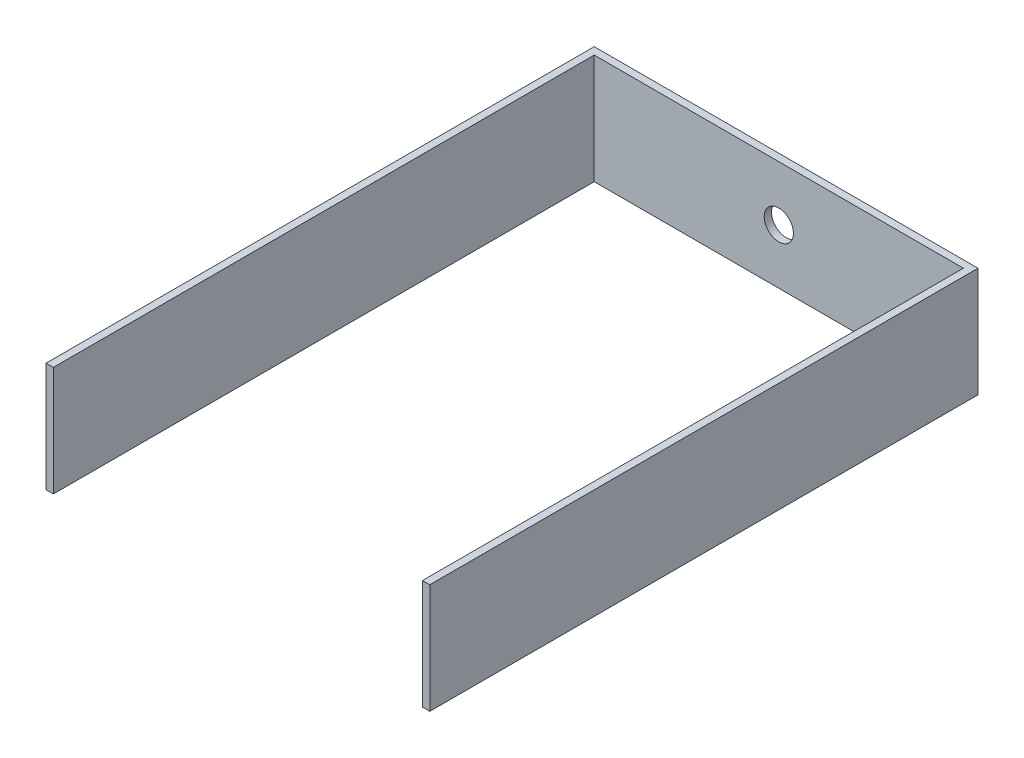
ISO-10303-21;
HEADER;
FILE_DESCRIPTION(('STEP AP214'),'2;1');
FILE_NAME('part.step','',(''),(''),'','','');
FILE_SCHEMA(('AUTOMOTIVE_DESIGN { 1 0 10303 214 1 1 1 1 }'));
ENDSEC;
DATA;
#1=APPLICATION_CONTEXT('core data for automotive mechanical design processes');
#2=APPLICATION_PROTOCOL_DEFINITION('international standard','automotive_design',2000,#1);
#3=PRODUCT_CONTEXT('',#1,'mechanical');
#4=PRODUCT('Part','Part','',(#3));
#5=PRODUCT_RELATED_PRODUCT_CATEGORY('part','',(#4));
#6=PRODUCT_DEFINITION_FORMATION('','',#4);
#7=PRODUCT_DEFINITION_CONTEXT('part definition',#1,'design');
#8=PRODUCT_DEFINITION('design','',#6,#7);
#9=PRODUCT_DEFINITION_SHAPE('','',#8);
#10=(LENGTH_UNIT() NAMED_UNIT(*) SI_UNIT(.MILLI.,.METRE.));
#11=(NAMED_UNIT(*) PLANE_ANGLE_UNIT() SI_UNIT($,.RADIAN.));
#12=(NAMED_UNIT(*) SI_UNIT($,.STERADIAN.) SOLID_ANGLE_UNIT());
#13=UNCERTAINTY_MEASURE_WITH_UNIT(LENGTH_MEASURE(1.E-05),#10,'distance_accuracy_value','');
#14=(GEOMETRIC_REPRESENTATION_CONTEXT(3) GLOBAL_UNCERTAINTY_ASSIGNED_CONTEXT((#13)) GLOBAL_UNIT_ASSIGNED_CONTEXT((#10,
#11,#12)) REPRESENTATION_CONTEXT('',''));
#15=CARTESIAN_POINT('',(0.,0.,0.));
#16=DIRECTION('',(0.,0.,1.));
#17=DIRECTION('',(1.,0.,0.));
#18=AXIS2_PLACEMENT_3D('',#15,#16,#17);
#19=CARTESIAN_POINT('',(-52.5,15.,0.));
#20=DIRECTION('',(0.,0.,-1.));
#21=DIRECTION('',(-1.,0.,0.));
#22=AXIS2_PLACEMENT_3D('',#19,#20,#21);
#23=PLANE('',#22);
#24=CARTESIAN_POINT('',(0.,0.,0.));
#25=DIRECTION('',(0.,0.,-1.));
#26=DIRECTION('',(-1.,0.,0.));
#27=AXIS2_PLACEMENT_3D('',#24,#25,#26);
#28=CIRCLE('',#27,4.);
#29=CARTESIAN_POINT('',(-4.,0.,0.));
#30=VERTEX_POINT('',#29);
#31=EDGE_CURVE('E182',#30,#30,#28,.T.);
#32=ORIENTED_EDGE('',*,*,#31,.F.);
#33=EDGE_LOOP('',(#32));
#34=FACE_BOUND('',#33,.T.);
#35=DIRECTION('',(1.,0.,0.));
#36=VECTOR('',#35,1.);
#37=CARTESIAN_POINT('',(-52.5,-15.,0.));
#38=LINE('',#37,#36);
#39=CARTESIAN_POINT('',(-52.5,-15.,0.));
#40=VERTEX_POINT('',#39);
#41=CARTESIAN_POINT('',(52.5,-15.,0.));
#42=VERTEX_POINT('',#41);
#43=EDGE_CURVE('E134',#40,#42,#38,.T.);
#44=ORIENTED_EDGE('',*,*,#43,.F.);
#45=DIRECTION('',(0.,-1.,0.));
#46=VECTOR('',#45,1.);
#47=CARTESIAN_POINT('',(-52.5,15.,0.));
#48=LINE('',#47,#46);
#49=CARTESIAN_POINT('',(-52.5,15.,0.));
#50=VERTEX_POINT('',#49);
#51=EDGE_CURVE('E11',#50,#40,#48,.T.);
#52=ORIENTED_EDGE('',*,*,#51,.F.);
#53=DIRECTION('',(1.,0.,0.));
#54=VECTOR('',#53,1.);
#55=CARTESIAN_POINT('',(-52.5,15.,0.));
#56=LINE('',#55,#54);
#57=CARTESIAN_POINT('',(52.5,15.,0.));
#58=VERTEX_POINT('',#57);
#59=EDGE_CURVE('E151',#50,#58,#56,.T.);
#60=ORIENTED_EDGE('',*,*,#59,.T.);
#61=DIRECTION('',(0.,-1.,0.));
#62=VECTOR('',#61,1.);
#63=CARTESIAN_POINT('',(52.5,15.,0.));
#64=LINE('',#63,#62);
#65=EDGE_CURVE('E89',#58,#42,#64,.T.);
#66=ORIENTED_EDGE('',*,*,#65,.T.);
#67=EDGE_LOOP('',(#44,#52,#60,#66));
#68=FACE_BOUND('',#67,.T.);
#69=ADVANCED_FACE('F35',(#34,#68),#23,.T.);
#70=CARTESIAN_POINT('',(-52.5,15.,0.));
#71=DIRECTION('',(1.,0.,0.));
#72=DIRECTION('',(0.,0.,-1.));
#73=AXIS2_PLACEMENT_3D('',#70,#71,#72);
#74=PLANE('',#73);
#75=DIRECTION('',(0.,0.,1.));
#76=VECTOR('',#75,1.);
#77=CARTESIAN_POINT('',(-52.5,-15.,0.));
#78=LINE('',#77,#76);
#79=CARTESIAN_POINT('',(-52.5,-15.,150.));
#80=VERTEX_POINT('',#79);
#81=EDGE_CURVE('E80',#40,#80,#78,.T.);
#82=ORIENTED_EDGE('',*,*,#81,.T.);
#83=DIRECTION('',(0.,-1.,0.));
#84=VECTOR('',#83,1.);
#85=CARTESIAN_POINT('',(-52.5,15.,150.));
#86=LINE('',#85,#84);
#87=CARTESIAN_POINT('',(-52.5,15.,150.));
#88=VERTEX_POINT('',#87);
#89=EDGE_CURVE('E44',#88,#80,#86,.T.);
#90=ORIENTED_EDGE('',*,*,#89,.F.);
#91=DIRECTION('',(0.,0.,1.));
#92=VECTOR('',#91,1.);
#93=CARTESIAN_POINT('',(-52.5,15.,0.));
#94=LINE('',#93,#92);
#95=EDGE_CURVE('E112',#50,#88,#94,.T.);
#96=ORIENTED_EDGE('',*,*,#95,.F.);
#97=ORIENTED_EDGE('',*,*,#51,.T.);
#98=EDGE_LOOP('',(#82,#90,#96,#97));
#99=FACE_BOUND('',#98,.T.);
#100=ADVANCED_FACE('F199',(#99),#74,.F.);
#101=CARTESIAN_POINT('',(-52.5,15.,150.));
#102=DIRECTION('',(0.,0.,-1.));
#103=DIRECTION('',(-1.,0.,0.));
#104=AXIS2_PLACEMENT_3D('',#101,#102,#103);
#105=PLANE('',#104);
#106=DIRECTION('',(1.,0.,0.));
#107=VECTOR('',#106,1.);
#108=CARTESIAN_POINT('',(-52.5,-15.,150.));
#109=LINE('',#108,#107);
#110=CARTESIAN_POINT('',(-50.5,-15.,150.));
#111=VERTEX_POINT('',#110);
#112=EDGE_CURVE('E119',#80,#111,#109,.T.);
#113=ORIENTED_EDGE('',*,*,#112,.T.);
#114=DIRECTION('',(0.,-1.,0.));
#115=VECTOR('',#114,1.);
#116=CARTESIAN_POINT('',(-50.5,15.,150.));
#117=LINE('',#116,#115);
#118=CARTESIAN_POINT('',(-50.5,15.,150.));
#119=VERTEX_POINT('',#118);
#120=EDGE_CURVE('E116',#119,#111,#117,.T.);
#121=ORIENTED_EDGE('',*,*,#120,.F.);
#122=DIRECTION('',(1.,0.,0.));
#123=VECTOR('',#122,1.);
#124=CARTESIAN_POINT('',(-52.5,15.,150.));
#125=LINE('',#124,#123);
#126=EDGE_CURVE('E106',#88,#119,#125,.T.);
#127=ORIENTED_EDGE('',*,*,#126,.F.);
#128=ORIENTED_EDGE('',*,*,#89,.T.);
#129=EDGE_LOOP('',(#113,#121,#127,#128));
#130=FACE_BOUND('',#129,.T.);
#131=ADVANCED_FACE('F117',(#130),#105,.F.);
#132=CARTESIAN_POINT('',(-50.5,15.,2.));
#133=DIRECTION('',(1.,0.,0.));
#134=DIRECTION('',(0.,0.,-1.));
#135=AXIS2_PLACEMENT_3D('',#132,#133,#134);
#136=PLANE('',#135);
#137=DIRECTION('',(0.,0.,1.));
#138=VECTOR('',#137,1.);
#139=CARTESIAN_POINT('',(-50.5,-15.,2.));
#140=LINE('',#139,#138);
#141=CARTESIAN_POINT('',(-50.5,-15.,2.));
#142=VERTEX_POINT('',#141);
#143=EDGE_CURVE('E148',#142,#111,#140,.T.);
#144=ORIENTED_EDGE('',*,*,#143,.F.);
#145=DIRECTION('',(0.,-1.,0.));
#146=VECTOR('',#145,1.);
#147=CARTESIAN_POINT('',(-50.5,15.,2.));
#148=LINE('',#147,#146);
#149=CARTESIAN_POINT('',(-50.5,15.,2.));
#150=VERTEX_POINT('',#149);
#151=EDGE_CURVE('E123',#150,#142,#148,.T.);
#152=ORIENTED_EDGE('',*,*,#151,.F.);
#153=DIRECTION('',(0.,0.,1.));
#154=VECTOR('',#153,1.);
#155=CARTESIAN_POINT('',(-50.5,15.,2.));
#156=LINE('',#155,#154);
#157=EDGE_CURVE('E111',#150,#119,#156,.T.);
#158=ORIENTED_EDGE('',*,*,#157,.T.);
#159=ORIENTED_EDGE('',*,*,#120,.T.);
#160=EDGE_LOOP('',(#144,#152,#158,#159));
#161=FACE_BOUND('',#160,.T.);
#162=ADVANCED_FACE('F125',(#161),#136,.T.);
#163=CARTESIAN_POINT('',(-50.5,15.,2.));
#164=DIRECTION('',(0.,0.,-1.));
#165=DIRECTION('',(-1.,0.,0.));
#166=AXIS2_PLACEMENT_3D('',#163,#164,#165);
#167=PLANE('',#166);
#168=CARTESIAN_POINT('',(0.,0.,2.));
#169=DIRECTION('',(0.,0.,-1.));
#170=DIRECTION('',(-1.,0.,0.));
#171=AXIS2_PLACEMENT_3D('',#168,#169,#170);
#172=CIRCLE('',#171,4.);
#173=CARTESIAN_POINT('',(-4.,0.,2.));
#174=VERTEX_POINT('',#173);
#175=EDGE_CURVE('E38',#174,#174,#172,.T.);
#176=ORIENTED_EDGE('',*,*,#175,.T.);
#177=EDGE_LOOP('',(#176));
#178=FACE_BOUND('',#177,.T.);
#179=DIRECTION('',(1.,0.,0.));
#180=VECTOR('',#179,1.);
#181=CARTESIAN_POINT('',(-50.5,-15.,2.));
#182=LINE('',#181,#180);
#183=CARTESIAN_POINT('',(50.5,-15.,2.));
#184=VERTEX_POINT('',#183);
#185=EDGE_CURVE('E146',#142,#184,#182,.T.);
#186=ORIENTED_EDGE('',*,*,#185,.T.);
#187=DIRECTION('',(0.,-1.,0.));
#188=VECTOR('',#187,1.);
#189=CARTESIAN_POINT('',(50.5,15.,2.));
#190=LINE('',#189,#188);
#191=CARTESIAN_POINT('',(50.5,15.,2.));
#192=VERTEX_POINT('',#191);
#193=EDGE_CURVE('E155',#192,#184,#190,.T.);
#194=ORIENTED_EDGE('',*,*,#193,.F.);
#195=DIRECTION('',(1.,0.,0.));
#196=VECTOR('',#195,1.);
#197=CARTESIAN_POINT('',(-50.5,15.,2.));
#198=LINE('',#197,#196);
#199=EDGE_CURVE('E127',#150,#192,#198,.T.);
#200=ORIENTED_EDGE('',*,*,#199,.F.);
#201=ORIENTED_EDGE('',*,*,#151,.T.);
#202=EDGE_LOOP('',(#186,#194,#200,#201));
#203=FACE_BOUND('',#202,.T.);
#204=ADVANCED_FACE('F169',(#178,#203),#167,.F.);
#205=CARTESIAN_POINT('',(50.5,15.,2.));
#206=DIRECTION('',(1.,0.,0.));
#207=DIRECTION('',(0.,0.,-1.));
#208=AXIS2_PLACEMENT_3D('',#205,#206,#207);
#209=PLANE('',#208);
#210=DIRECTION('',(0.,0.,1.));
#211=VECTOR('',#210,1.);
#212=CARTESIAN_POINT('',(50.5,-15.,2.));
#213=LINE('',#212,#211);
#214=CARTESIAN_POINT('',(50.5,-15.,150.));
#215=VERTEX_POINT('',#214);
#216=EDGE_CURVE('E143',#184,#215,#213,.T.);
#217=ORIENTED_EDGE('',*,*,#216,.T.);
#218=DIRECTION('',(0.,-1.,0.));
#219=VECTOR('',#218,1.);
#220=CARTESIAN_POINT('',(50.5,15.,150.));
#221=LINE('',#220,#219);
#222=CARTESIAN_POINT('',(50.5,15.,150.));
#223=VERTEX_POINT('',#222);
#224=EDGE_CURVE('E158',#223,#215,#221,.T.);
#225=ORIENTED_EDGE('',*,*,#224,.F.);
#226=DIRECTION('',(0.,0.,1.));
#227=VECTOR('',#226,1.);
#228=CARTESIAN_POINT('',(50.5,15.,2.));
#229=LINE('',#228,#227);
#230=EDGE_CURVE('E129',#192,#223,#229,.T.);
#231=ORIENTED_EDGE('',*,*,#230,.F.);
#232=ORIENTED_EDGE('',*,*,#193,.T.);
#233=EDGE_LOOP('',(#217,#225,#231,#232));
#234=FACE_BOUND('',#233,.T.);
#235=ADVANCED_FACE('F172',(#234),#209,.F.);
#236=CARTESIAN_POINT('',(52.5,15.,150.));
#237=DIRECTION('',(0.,0.,1.));
#238=DIRECTION('',(1.,0.,0.));
#239=AXIS2_PLACEMENT_3D('',#236,#237,#238);
#240=PLANE('',#239);
#241=DIRECTION('',(-1.,0.,0.));
#242=VECTOR('',#241,1.);
#243=CARTESIAN_POINT('',(52.5,-15.,150.));
#244=LINE('',#243,#242);
#245=CARTESIAN_POINT('',(52.5,-15.,150.));
#246=VERTEX_POINT('',#245);
#247=EDGE_CURVE('E140',#246,#215,#244,.T.);
#248=ORIENTED_EDGE('',*,*,#247,.F.);
#249=DIRECTION('',(0.,-1.,0.));
#250=VECTOR('',#249,1.);
#251=CARTESIAN_POINT('',(52.5,15.,150.));
#252=LINE('',#251,#250);
#253=CARTESIAN_POINT('',(52.5,15.,150.));
#254=VERTEX_POINT('',#253);
#255=EDGE_CURVE('E160',#254,#246,#252,.T.);
#256=ORIENTED_EDGE('',*,*,#255,.F.);
#257=DIRECTION('',(-1.,0.,0.));
#258=VECTOR('',#257,1.);
#259=CARTESIAN_POINT('',(52.5,15.,150.));
#260=LINE('',#259,#258);
#261=EDGE_CURVE('E176',#254,#223,#260,.T.);
#262=ORIENTED_EDGE('',*,*,#261,.T.);
#263=ORIENTED_EDGE('',*,*,#224,.T.);
#264=EDGE_LOOP('',(#248,#256,#262,#263));
#265=FACE_BOUND('',#264,.T.);
#266=ADVANCED_FACE('F216',(#265),#240,.T.);
#267=CARTESIAN_POINT('',(52.5,15.,0.));
#268=DIRECTION('',(1.,0.,0.));
#269=DIRECTION('',(0.,0.,-1.));
#270=AXIS2_PLACEMENT_3D('',#267,#268,#269);
#271=PLANE('',#270);
#272=DIRECTION('',(0.,0.,1.));
#273=VECTOR('',#272,1.);
#274=CARTESIAN_POINT('',(52.5,-15.,0.));
#275=LINE('',#274,#273);
#276=EDGE_CURVE('E137',#42,#246,#275,.T.);
#277=ORIENTED_EDGE('',*,*,#276,.F.);
#278=ORIENTED_EDGE('',*,*,#65,.F.);
#279=DIRECTION('',(0.,0.,1.));
#280=VECTOR('',#279,1.);
#281=CARTESIAN_POINT('',(52.5,15.,0.));
#282=LINE('',#281,#280);
#283=EDGE_CURVE('E177',#58,#254,#282,.T.);
#284=ORIENTED_EDGE('',*,*,#283,.T.);
#285=ORIENTED_EDGE('',*,*,#255,.T.);
#286=EDGE_LOOP('',(#277,#278,#284,#285));
#287=FACE_BOUND('',#286,.T.);
#288=ADVANCED_FACE('F161',(#287),#271,.T.);
#289=CARTESIAN_POINT('',(0.,15.,0.));
#290=DIRECTION('',(0.,-1.,0.));
#291=DIRECTION('',(0.,0.,-1.));
#292=AXIS2_PLACEMENT_3D('',#289,#290,#291);
#293=PLANE('',#292);
#294=ORIENTED_EDGE('',*,*,#59,.F.);
#295=ORIENTED_EDGE('',*,*,#95,.T.);
#296=ORIENTED_EDGE('',*,*,#126,.T.);
#297=ORIENTED_EDGE('',*,*,#157,.F.);
#298=ORIENTED_EDGE('',*,*,#199,.T.);
#299=ORIENTED_EDGE('',*,*,#230,.T.);
#300=ORIENTED_EDGE('',*,*,#261,.F.);
#301=ORIENTED_EDGE('',*,*,#283,.F.);
#302=EDGE_LOOP('',(#294,#295,#296,#297,#298,#299,#300,#301));
#303=FACE_BOUND('',#302,.T.);
#304=ADVANCED_FACE('F109',(#303),#293,.F.);
#305=CARTESIAN_POINT('',(0.,-15.,0.));
#306=DIRECTION('',(0.,-1.,0.));
#307=DIRECTION('',(0.,0.,-1.));
#308=AXIS2_PLACEMENT_3D('',#305,#306,#307);
#309=PLANE('',#308);
#310=ORIENTED_EDGE('',*,*,#43,.T.);
#311=ORIENTED_EDGE('',*,*,#276,.T.);
#312=ORIENTED_EDGE('',*,*,#247,.T.);
#313=ORIENTED_EDGE('',*,*,#216,.F.);
#314=ORIENTED_EDGE('',*,*,#185,.F.);
#315=ORIENTED_EDGE('',*,*,#143,.T.);
#316=ORIENTED_EDGE('',*,*,#112,.F.);
#317=ORIENTED_EDGE('',*,*,#81,.F.);
#318=EDGE_LOOP('',(#310,#311,#312,#313,#314,#315,#316,#317));
#319=FACE_BOUND('',#318,.T.);
#320=ADVANCED_FACE('F164',(#319),#309,.T.);
#321=CARTESIAN_POINT('',(0.,0.,150.));
#322=DIRECTION('',(0.,0.,-1.));
#323=DIRECTION('',(-1.,0.,0.));
#324=AXIS2_PLACEMENT_3D('',#321,#322,#323);
#325=CYLINDRICAL_SURFACE('',#324,4.);
#326=ORIENTED_EDGE('',*,*,#31,.T.);
#327=EDGE_LOOP('',(#326));
#328=FACE_BOUND('',#327,.T.);
#329=ORIENTED_EDGE('',*,*,#175,.F.);
#330=EDGE_LOOP('',(#329));
#331=FACE_BOUND('',#330,.T.);
#332=ADVANCED_FACE('F190',(#328,#331),#325,.F.);
#333=CLOSED_SHELL('',(#69,#100,#131,#162,#204,#235,#266,#288,#304,#320,#332));
#334=MANIFOLD_SOLID_BREP('B2',#333);
#335=ADVANCED_BREP_SHAPE_REPRESENTATION('',(#18,#334),#14);
#336=SHAPE_DEFINITION_REPRESENTATION(#9,#335);
ENDSEC;
END-ISO-10303-21;
